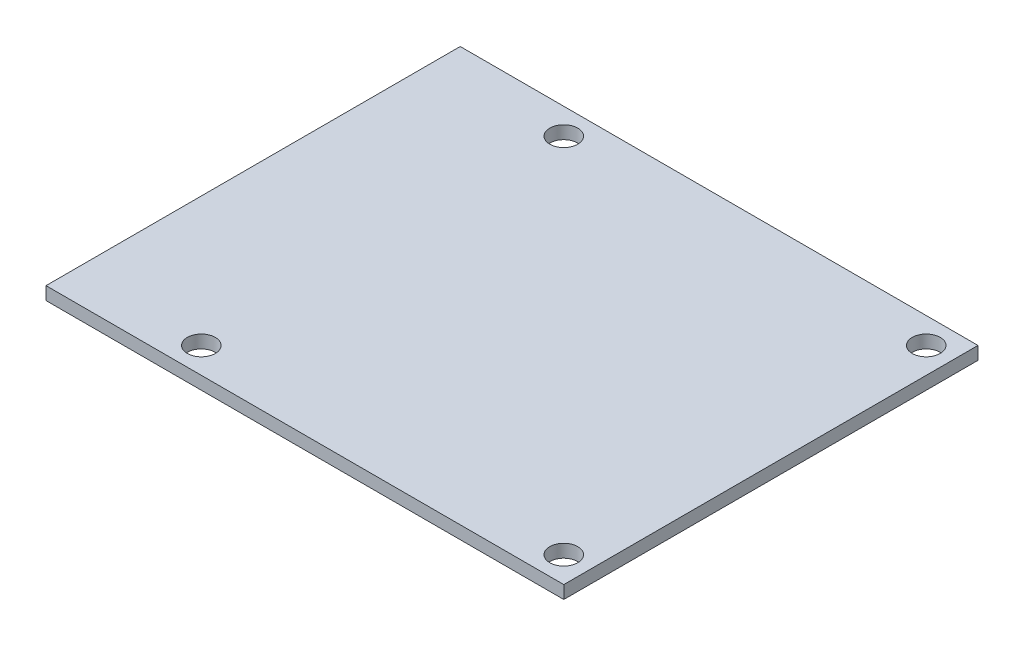
ISO-10303-21;
HEADER;
FILE_DESCRIPTION(('STEP AP214'),'2;1');
FILE_NAME('part.step','',(''),(''),'','','');
FILE_SCHEMA(('AUTOMOTIVE_DESIGN { 1 0 10303 214 1 1 1 1 }'));
ENDSEC;
DATA;
#1=APPLICATION_CONTEXT('core data for automotive mechanical design processes');
#2=APPLICATION_PROTOCOL_DEFINITION('international standard','automotive_design',2000,#1);
#3=PRODUCT_CONTEXT('',#1,'mechanical');
#4=PRODUCT('Part','Part','',(#3));
#5=PRODUCT_RELATED_PRODUCT_CATEGORY('part','',(#4));
#6=PRODUCT_DEFINITION_FORMATION('','',#4);
#7=PRODUCT_DEFINITION_CONTEXT('part definition',#1,'design');
#8=PRODUCT_DEFINITION('design','',#6,#7);
#9=PRODUCT_DEFINITION_SHAPE('','',#8);
#10=(LENGTH_UNIT() NAMED_UNIT(*) SI_UNIT(.MILLI.,.METRE.));
#11=(NAMED_UNIT(*) PLANE_ANGLE_UNIT() SI_UNIT($,.RADIAN.));
#12=(NAMED_UNIT(*) SI_UNIT($,.STERADIAN.) SOLID_ANGLE_UNIT());
#13=UNCERTAINTY_MEASURE_WITH_UNIT(LENGTH_MEASURE(1.E-05),#10,'distance_accuracy_value','');
#14=(GEOMETRIC_REPRESENTATION_CONTEXT(3) GLOBAL_UNCERTAINTY_ASSIGNED_CONTEXT((#13)) GLOBAL_UNIT_ASSIGNED_CONTEXT((#10,
#11,#12)) REPRESENTATION_CONTEXT('',''));
#15=CARTESIAN_POINT('',(0.,0.,0.));
#16=DIRECTION('',(0.,0.,1.));
#17=DIRECTION('',(1.,0.,0.));
#18=AXIS2_PLACEMENT_3D('',#15,#16,#17);
#19=CARTESIAN_POINT('',(63.5,3.175,50.8));
#20=DIRECTION('',(-1.,0.,0.));
#21=DIRECTION('',(0.,0.,1.));
#22=AXIS2_PLACEMENT_3D('',#19,#20,#21);
#23=PLANE('',#22);
#24=DIRECTION('',(0.,0.,-1.));
#25=VECTOR('',#24,1.);
#26=CARTESIAN_POINT('',(63.5,0.,50.8));
#27=LINE('',#26,#25);
#28=CARTESIAN_POINT('',(63.5,0.,50.8));
#29=VERTEX_POINT('',#28);
#30=CARTESIAN_POINT('',(63.5,0.,-50.8));
#31=VERTEX_POINT('',#30);
#32=EDGE_CURVE('E96',#29,#31,#27,.T.);
#33=ORIENTED_EDGE('',*,*,#32,.T.);
#34=DIRECTION('',(0.,-1.,0.));
#35=VECTOR('',#34,1.);
#36=CARTESIAN_POINT('',(63.5,3.175,-50.8));
#37=LINE('',#36,#35);
#38=CARTESIAN_POINT('',(63.5,3.175,-50.8));
#39=VERTEX_POINT('',#38);
#40=EDGE_CURVE('E11',#39,#31,#37,.T.);
#41=ORIENTED_EDGE('',*,*,#40,.F.);
#42=DIRECTION('',(0.,0.,-1.));
#43=VECTOR('',#42,1.);
#44=CARTESIAN_POINT('',(63.5,3.175,50.8));
#45=LINE('',#44,#43);
#46=CARTESIAN_POINT('',(63.5,3.175,50.8));
#47=VERTEX_POINT('',#46);
#48=EDGE_CURVE('E84',#47,#39,#45,.T.);
#49=ORIENTED_EDGE('',*,*,#48,.F.);
#50=DIRECTION('',(0.,-1.,0.));
#51=VECTOR('',#50,1.);
#52=CARTESIAN_POINT('',(63.5,3.175,50.8));
#53=LINE('',#52,#51);
#54=EDGE_CURVE('E92',#47,#29,#53,.T.);
#55=ORIENTED_EDGE('',*,*,#54,.T.);
#56=EDGE_LOOP('',(#33,#41,#49,#55));
#57=FACE_BOUND('',#56,.T.);
#58=ADVANCED_FACE('F33',(#57),#23,.F.);
#59=CARTESIAN_POINT('',(-63.5,3.175,-50.8));
#60=DIRECTION('',(0.,0.,1.));
#61=DIRECTION('',(1.,0.,0.));
#62=AXIS2_PLACEMENT_3D('',#59,#60,#61);
#63=PLANE('',#62);
#64=DIRECTION('',(-1.,0.,0.));
#65=VECTOR('',#64,1.);
#66=CARTESIAN_POINT('',(-63.5,0.,-50.8));
#67=LINE('',#66,#65);
#68=CARTESIAN_POINT('',(-63.5,0.,-50.8));
#69=VERTEX_POINT('',#68);
#70=EDGE_CURVE('E88',#31,#69,#67,.T.);
#71=ORIENTED_EDGE('',*,*,#70,.T.);
#72=DIRECTION('',(0.,-1.,0.));
#73=VECTOR('',#72,1.);
#74=CARTESIAN_POINT('',(-63.5,3.175,-50.8));
#75=LINE('',#74,#73);
#76=CARTESIAN_POINT('',(-63.5,3.175,-50.8));
#77=VERTEX_POINT('',#76);
#78=EDGE_CURVE('E41',#77,#69,#75,.T.);
#79=ORIENTED_EDGE('',*,*,#78,.F.);
#80=DIRECTION('',(-1.,0.,0.));
#81=VECTOR('',#80,1.);
#82=CARTESIAN_POINT('',(-63.5,3.175,-50.8));
#83=LINE('',#82,#81);
#84=EDGE_CURVE('E79',#39,#77,#83,.T.);
#85=ORIENTED_EDGE('',*,*,#84,.F.);
#86=ORIENTED_EDGE('',*,*,#40,.T.);
#87=EDGE_LOOP('',(#71,#79,#85,#86));
#88=FACE_BOUND('',#87,.T.);
#89=ADVANCED_FACE('F87',(#88),#63,.F.);
#90=CARTESIAN_POINT('',(-63.5,3.175,50.8));
#91=DIRECTION('',(1.,0.,0.));
#92=DIRECTION('',(0.,0.,-1.));
#93=AXIS2_PLACEMENT_3D('',#90,#91,#92);
#94=PLANE('',#93);
#95=DIRECTION('',(0.,0.,1.));
#96=VECTOR('',#95,1.);
#97=CARTESIAN_POINT('',(-63.5,0.,50.8));
#98=LINE('',#97,#96);
#99=CARTESIAN_POINT('',(-63.5,0.,50.8));
#100=VERTEX_POINT('',#99);
#101=EDGE_CURVE('E66',#69,#100,#98,.T.);
#102=ORIENTED_EDGE('',*,*,#101,.T.);
#103=DIRECTION('',(0.,-1.,0.));
#104=VECTOR('',#103,1.);
#105=CARTESIAN_POINT('',(-63.5,3.175,50.8));
#106=LINE('',#105,#104);
#107=CARTESIAN_POINT('',(-63.5,3.175,50.8));
#108=VERTEX_POINT('',#107);
#109=EDGE_CURVE('E89',#108,#100,#106,.T.);
#110=ORIENTED_EDGE('',*,*,#109,.F.);
#111=DIRECTION('',(0.,0.,1.));
#112=VECTOR('',#111,1.);
#113=CARTESIAN_POINT('',(-63.5,3.175,50.8));
#114=LINE('',#113,#112);
#115=EDGE_CURVE('E82',#77,#108,#114,.T.);
#116=ORIENTED_EDGE('',*,*,#115,.F.);
#117=ORIENTED_EDGE('',*,*,#78,.T.);
#118=EDGE_LOOP('',(#102,#110,#116,#117));
#119=FACE_BOUND('',#118,.T.);
#120=ADVANCED_FACE('F90',(#119),#94,.F.);
#121=CARTESIAN_POINT('',(-63.5,3.175,50.8));
#122=DIRECTION('',(0.,0.,-1.));
#123=DIRECTION('',(-1.,0.,0.));
#124=AXIS2_PLACEMENT_3D('',#121,#122,#123);
#125=PLANE('',#124);
#126=DIRECTION('',(1.,0.,0.));
#127=VECTOR('',#126,1.);
#128=CARTESIAN_POINT('',(-63.5,0.,50.8));
#129=LINE('',#128,#127);
#130=EDGE_CURVE('E72',#100,#29,#129,.T.);
#131=ORIENTED_EDGE('',*,*,#130,.T.);
#132=ORIENTED_EDGE('',*,*,#54,.F.);
#133=DIRECTION('',(1.,0.,0.));
#134=VECTOR('',#133,1.);
#135=CARTESIAN_POINT('',(-63.5,3.175,50.8));
#136=LINE('',#135,#134);
#137=EDGE_CURVE('E49',#108,#47,#136,.T.);
#138=ORIENTED_EDGE('',*,*,#137,.F.);
#139=ORIENTED_EDGE('',*,*,#109,.T.);
#140=EDGE_LOOP('',(#131,#132,#138,#139));
#141=FACE_BOUND('',#140,.T.);
#142=ADVANCED_FACE('F104',(#141),#125,.F.);
#143=CARTESIAN_POINT('',(0.,3.175,0.));
#144=DIRECTION('',(0.,-1.,0.));
#145=DIRECTION('',(0.,0.,-1.));
#146=AXIS2_PLACEMENT_3D('',#143,#144,#145);
#147=PLANE('',#146);
#148=CARTESIAN_POINT('',(57.1500000000003,3.175,-44.45));
#149=DIRECTION('',(0.,-1.,0.));
#150=DIRECTION('',(0.,0.,-1.));
#151=AXIS2_PLACEMENT_3D('',#148,#149,#150);
#152=CIRCLE('',#151,3.429);
#153=CARTESIAN_POINT('',(57.1500000000003,3.175,-47.879));
#154=VERTEX_POINT('',#153);
#155=EDGE_CURVE('E119',#154,#154,#152,.T.);
#156=ORIENTED_EDGE('',*,*,#155,.T.);
#157=EDGE_LOOP('',(#156));
#158=FACE_BOUND('',#157,.T.);
#159=CARTESIAN_POINT('',(-31.7499999999997,3.175,-44.45));
#160=DIRECTION('',(0.,-1.,0.));
#161=DIRECTION('',(0.,0.,-1.));
#162=AXIS2_PLACEMENT_3D('',#159,#160,#161);
#163=CIRCLE('',#162,3.429);
#164=CARTESIAN_POINT('',(-31.7499999999997,3.175,-47.879));
#165=VERTEX_POINT('',#164);
#166=EDGE_CURVE('E125',#165,#165,#163,.T.);
#167=ORIENTED_EDGE('',*,*,#166,.T.);
#168=EDGE_LOOP('',(#167));
#169=FACE_BOUND('',#168,.T.);
#170=CARTESIAN_POINT('',(-31.75,3.175,44.45));
#171=DIRECTION('',(0.,-1.,0.));
#172=DIRECTION('',(0.,0.,-1.));
#173=AXIS2_PLACEMENT_3D('',#170,#171,#172);
#174=CIRCLE('',#173,3.429);
#175=CARTESIAN_POINT('',(-31.75,3.175,41.021));
#176=VERTEX_POINT('',#175);
#177=EDGE_CURVE('E113',#176,#176,#174,.T.);
#178=ORIENTED_EDGE('',*,*,#177,.T.);
#179=EDGE_LOOP('',(#178));
#180=FACE_BOUND('',#179,.T.);
#181=CARTESIAN_POINT('',(57.15,3.175,44.45));
#182=DIRECTION('',(0.,-1.,0.));
#183=DIRECTION('',(0.,0.,-1.));
#184=AXIS2_PLACEMENT_3D('',#181,#182,#183);
#185=CIRCLE('',#184,3.429);
#186=CARTESIAN_POINT('',(57.15,3.175,41.021));
#187=VERTEX_POINT('',#186);
#188=EDGE_CURVE('E99',#187,#187,#185,.T.);
#189=ORIENTED_EDGE('',*,*,#188,.T.);
#190=EDGE_LOOP('',(#189));
#191=FACE_BOUND('',#190,.T.);
#192=ORIENTED_EDGE('',*,*,#48,.T.);
#193=ORIENTED_EDGE('',*,*,#84,.T.);
#194=ORIENTED_EDGE('',*,*,#115,.T.);
#195=ORIENTED_EDGE('',*,*,#137,.T.);
#196=EDGE_LOOP('',(#192,#193,#194,#195));
#197=FACE_BOUND('',#196,.T.);
#198=ADVANCED_FACE('F80',(#158,#169,#180,#191,#197),#147,.F.);
#199=CARTESIAN_POINT('',(0.,0.,0.));
#200=DIRECTION('',(0.,-1.,0.));
#201=DIRECTION('',(0.,0.,-1.));
#202=AXIS2_PLACEMENT_3D('',#199,#200,#201);
#203=PLANE('',#202);
#204=CARTESIAN_POINT('',(57.1500000000003,0.,-44.45));
#205=DIRECTION('',(0.,-1.,0.));
#206=DIRECTION('',(0.,0.,-1.));
#207=AXIS2_PLACEMENT_3D('',#204,#205,#206);
#208=CIRCLE('',#207,3.429);
#209=CARTESIAN_POINT('',(57.1500000000003,0.,-47.879));
#210=VERTEX_POINT('',#209);
#211=EDGE_CURVE('E116',#210,#210,#208,.T.);
#212=ORIENTED_EDGE('',*,*,#211,.F.);
#213=EDGE_LOOP('',(#212));
#214=FACE_BOUND('',#213,.T.);
#215=CARTESIAN_POINT('',(-31.7499999999997,0.,-44.45));
#216=DIRECTION('',(0.,-1.,0.));
#217=DIRECTION('',(0.,0.,-1.));
#218=AXIS2_PLACEMENT_3D('',#215,#216,#217);
#219=CIRCLE('',#218,3.429);
#220=CARTESIAN_POINT('',(-31.7499999999997,0.,-47.879));
#221=VERTEX_POINT('',#220);
#222=EDGE_CURVE('E122',#221,#221,#219,.T.);
#223=ORIENTED_EDGE('',*,*,#222,.F.);
#224=EDGE_LOOP('',(#223));
#225=FACE_BOUND('',#224,.T.);
#226=CARTESIAN_POINT('',(-31.75,0.,44.45));
#227=DIRECTION('',(0.,-1.,0.));
#228=DIRECTION('',(0.,0.,-1.));
#229=AXIS2_PLACEMENT_3D('',#226,#227,#228);
#230=CIRCLE('',#229,3.429);
#231=CARTESIAN_POINT('',(-31.75,0.,41.021));
#232=VERTEX_POINT('',#231);
#233=EDGE_CURVE('E128',#232,#232,#230,.T.);
#234=ORIENTED_EDGE('',*,*,#233,.F.);
#235=EDGE_LOOP('',(#234));
#236=FACE_BOUND('',#235,.T.);
#237=CARTESIAN_POINT('',(57.15,0.,44.45));
#238=DIRECTION('',(0.,-1.,0.));
#239=DIRECTION('',(0.,0.,-1.));
#240=AXIS2_PLACEMENT_3D('',#237,#238,#239);
#241=CIRCLE('',#240,3.429);
#242=CARTESIAN_POINT('',(57.15,0.,41.021));
#243=VERTEX_POINT('',#242);
#244=EDGE_CURVE('E110',#243,#243,#241,.T.);
#245=ORIENTED_EDGE('',*,*,#244,.F.);
#246=EDGE_LOOP('',(#245));
#247=FACE_BOUND('',#246,.T.);
#248=ORIENTED_EDGE('',*,*,#32,.F.);
#249=ORIENTED_EDGE('',*,*,#130,.F.);
#250=ORIENTED_EDGE('',*,*,#101,.F.);
#251=ORIENTED_EDGE('',*,*,#70,.F.);
#252=EDGE_LOOP('',(#248,#249,#250,#251));
#253=FACE_BOUND('',#252,.T.);
#254=ADVANCED_FACE('F107',(#214,#225,#236,#247,#253),#203,.T.);
#255=CARTESIAN_POINT('',(57.15,3.175,44.45));
#256=DIRECTION('',(0.,-1.,0.));
#257=DIRECTION('',(0.,0.,-1.));
#258=AXIS2_PLACEMENT_3D('',#255,#256,#257);
#259=CYLINDRICAL_SURFACE('',#258,3.429);
#260=ORIENTED_EDGE('',*,*,#188,.F.);
#261=EDGE_LOOP('',(#260));
#262=FACE_BOUND('',#261,.T.);
#263=ORIENTED_EDGE('',*,*,#244,.T.);
#264=EDGE_LOOP('',(#263));
#265=FACE_BOUND('',#264,.T.);
#266=ADVANCED_FACE('F140',(#262,#265),#259,.F.);
#267=CARTESIAN_POINT('',(-31.75,3.175,44.45));
#268=DIRECTION('',(0.,-1.,0.));
#269=DIRECTION('',(0.,0.,-1.));
#270=AXIS2_PLACEMENT_3D('',#267,#268,#269);
#271=CYLINDRICAL_SURFACE('',#270,3.429);
#272=ORIENTED_EDGE('',*,*,#177,.F.);
#273=EDGE_LOOP('',(#272));
#274=FACE_BOUND('',#273,.T.);
#275=ORIENTED_EDGE('',*,*,#233,.T.);
#276=EDGE_LOOP('',(#275));
#277=FACE_BOUND('',#276,.T.);
#278=ADVANCED_FACE('F136',(#274,#277),#271,.F.);
#279=CARTESIAN_POINT('',(-31.7499999999997,3.175,-44.45));
#280=DIRECTION('',(0.,-1.,0.));
#281=DIRECTION('',(0.,0.,-1.));
#282=AXIS2_PLACEMENT_3D('',#279,#280,#281);
#283=CYLINDRICAL_SURFACE('',#282,3.429);
#284=ORIENTED_EDGE('',*,*,#166,.F.);
#285=EDGE_LOOP('',(#284));
#286=FACE_BOUND('',#285,.T.);
#287=ORIENTED_EDGE('',*,*,#222,.T.);
#288=EDGE_LOOP('',(#287));
#289=FACE_BOUND('',#288,.T.);
#290=ADVANCED_FACE('F139',(#286,#289),#283,.F.);
#291=CARTESIAN_POINT('',(57.1500000000003,3.175,-44.45));
#292=DIRECTION('',(0.,-1.,0.));
#293=DIRECTION('',(0.,0.,-1.));
#294=AXIS2_PLACEMENT_3D('',#291,#292,#293);
#295=CYLINDRICAL_SURFACE('',#294,3.429);
#296=ORIENTED_EDGE('',*,*,#155,.F.);
#297=EDGE_LOOP('',(#296));
#298=FACE_BOUND('',#297,.T.);
#299=ORIENTED_EDGE('',*,*,#211,.T.);
#300=EDGE_LOOP('',(#299));
#301=FACE_BOUND('',#300,.T.);
#302=ADVANCED_FACE('F178',(#298,#301),#295,.F.);
#303=CLOSED_SHELL('',(#58,#89,#120,#142,#198,#254,#266,#278,#290,#302));
#304=MANIFOLD_SOLID_BREP('B2',#303);
#305=ADVANCED_BREP_SHAPE_REPRESENTATION('',(#18,#304),#14);
#306=SHAPE_DEFINITION_REPRESENTATION(#9,#305);
ENDSEC;
END-ISO-10303-21;
